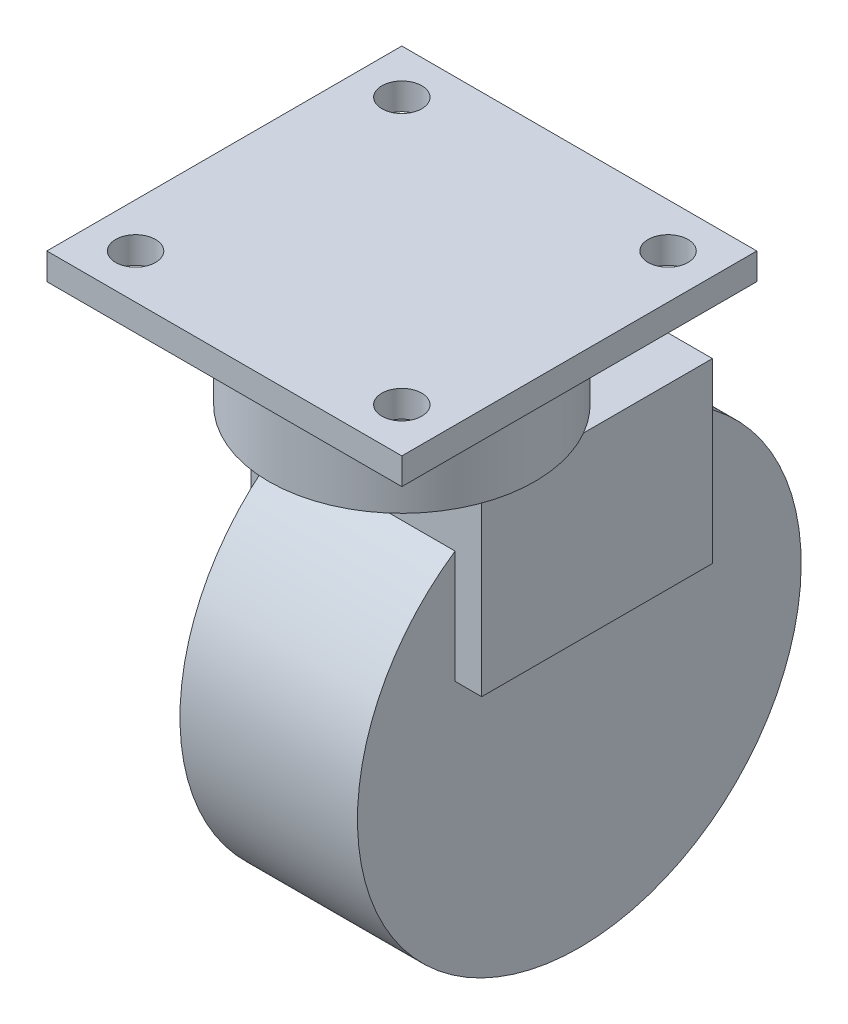
ISO-10303-21;
HEADER;
FILE_DESCRIPTION(('STEP AP214'),'2;1');
FILE_NAME('part.step','',(''),(''),'','','');
FILE_SCHEMA(('AUTOMOTIVE_DESIGN { 1 0 10303 214 1 1 1 1 }'));
ENDSEC;
DATA;
#1=APPLICATION_CONTEXT('core data for automotive mechanical design processes');
#2=APPLICATION_PROTOCOL_DEFINITION('international standard','automotive_design',2000,#1);
#3=PRODUCT_CONTEXT('',#1,'mechanical');
#4=PRODUCT('Part','Part','',(#3));
#5=PRODUCT_RELATED_PRODUCT_CATEGORY('part','',(#4));
#6=PRODUCT_DEFINITION_FORMATION('','',#4);
#7=PRODUCT_DEFINITION_CONTEXT('part definition',#1,'design');
#8=PRODUCT_DEFINITION('design','',#6,#7);
#9=PRODUCT_DEFINITION_SHAPE('','',#8);
#10=(LENGTH_UNIT() NAMED_UNIT(*) SI_UNIT(.MILLI.,.METRE.));
#11=(NAMED_UNIT(*) PLANE_ANGLE_UNIT() SI_UNIT($,.RADIAN.));
#12=(NAMED_UNIT(*) SI_UNIT($,.STERADIAN.) SOLID_ANGLE_UNIT());
#13=UNCERTAINTY_MEASURE_WITH_UNIT(LENGTH_MEASURE(1.E-05),#10,'distance_accuracy_value','');
#14=(GEOMETRIC_REPRESENTATION_CONTEXT(3) GLOBAL_UNCERTAINTY_ASSIGNED_CONTEXT((#13)) GLOBAL_UNIT_ASSIGNED_CONTEXT((#10,
#11,#12)) REPRESENTATION_CONTEXT('',''));
#15=CARTESIAN_POINT('',(0.,0.,0.));
#16=DIRECTION('',(0.,0.,1.));
#17=DIRECTION('',(1.,0.,0.));
#18=AXIS2_PLACEMENT_3D('',#15,#16,#17);
#19=CARTESIAN_POINT('',(0.,-35.,0.));
#20=DIRECTION('',(0.,1.,0.));
#21=DIRECTION('',(0.,0.,1.));
#22=AXIS2_PLACEMENT_3D('',#19,#20,#21);
#23=PLANE('',#22);
#24=DIRECTION('',(0.,0.,-1.));
#25=VECTOR('',#24,1.);
#26=CARTESIAN_POINT('',(-10.,-35.,0.));
#27=LINE('',#26,#25);
#28=CARTESIAN_POINT('',(-10.,-35.,4.));
#29=VERTEX_POINT('',#28);
#30=CARTESIAN_POINT('',(-10.,-35.,-22.));
#31=VERTEX_POINT('',#30);
#32=EDGE_CURVE('E132',#29,#31,#27,.T.);
#33=ORIENTED_EDGE('',*,*,#32,.F.);
#34=DIRECTION('',(1.,0.,0.));
#35=VECTOR('',#34,1.);
#36=CARTESIAN_POINT('',(-13.,-35.,4.));
#37=LINE('',#36,#35);
#38=CARTESIAN_POINT('',(-13.,-35.,4.));
#39=VERTEX_POINT('',#38);
#40=EDGE_CURVE('E242',#39,#29,#37,.T.);
#41=ORIENTED_EDGE('',*,*,#40,.F.);
#42=DIRECTION('',(0.,0.,1.));
#43=VECTOR('',#42,1.);
#44=CARTESIAN_POINT('',(-13.,-35.,-22.));
#45=LINE('',#44,#43);
#46=CARTESIAN_POINT('',(-13.,-35.,-22.));
#47=VERTEX_POINT('',#46);
#48=EDGE_CURVE('E140',#47,#39,#45,.T.);
#49=ORIENTED_EDGE('',*,*,#48,.F.);
#50=DIRECTION('',(-1.,0.,0.));
#51=VECTOR('',#50,1.);
#52=CARTESIAN_POINT('',(-13.,-35.,-22.));
#53=LINE('',#52,#51);
#54=EDGE_CURVE('E135',#31,#47,#53,.T.);
#55=ORIENTED_EDGE('',*,*,#54,.F.);
#56=EDGE_LOOP('',(#33,#41,#49,#55));
#57=FACE_BOUND('',#56,.T.);
#58=ADVANCED_FACE('F39',(#57),#23,.F.);
#59=CARTESIAN_POINT('',(-20.,-3.,-20.));
#60=DIRECTION('',(-1.,0.,0.));
#61=DIRECTION('',(0.,0.,1.));
#62=AXIS2_PLACEMENT_3D('',#59,#60,#61);
#63=PLANE('',#62);
#64=DIRECTION('',(0.,0.,1.));
#65=VECTOR('',#64,1.);
#66=CARTESIAN_POINT('',(-20.,0.,-20.));
#67=LINE('',#66,#65);
#68=CARTESIAN_POINT('',(-20.,0.,-20.));
#69=VERTEX_POINT('',#68);
#70=CARTESIAN_POINT('',(-20.,0.,20.));
#71=VERTEX_POINT('',#70);
#72=EDGE_CURVE('E178',#69,#71,#67,.T.);
#73=ORIENTED_EDGE('',*,*,#72,.F.);
#74=DIRECTION('',(0.,1.,0.));
#75=VECTOR('',#74,1.);
#76=CARTESIAN_POINT('',(-20.,-3.,-20.));
#77=LINE('',#76,#75);
#78=CARTESIAN_POINT('',(-20.,-3.,-20.));
#79=VERTEX_POINT('',#78);
#80=EDGE_CURVE('E157',#79,#69,#77,.T.);
#81=ORIENTED_EDGE('',*,*,#80,.F.);
#82=DIRECTION('',(0.,0.,1.));
#83=VECTOR('',#82,1.);
#84=CARTESIAN_POINT('',(-20.,-3.,-20.));
#85=LINE('',#84,#83);
#86=CARTESIAN_POINT('',(-20.,-3.,20.));
#87=VERTEX_POINT('',#86);
#88=EDGE_CURVE('E171',#79,#87,#85,.T.);
#89=ORIENTED_EDGE('',*,*,#88,.T.);
#90=DIRECTION('',(0.,1.,0.));
#91=VECTOR('',#90,1.);
#92=CARTESIAN_POINT('',(-20.,-3.,20.));
#93=LINE('',#92,#91);
#94=EDGE_CURVE('E158',#87,#71,#93,.T.);
#95=ORIENTED_EDGE('',*,*,#94,.T.);
#96=EDGE_LOOP('',(#73,#81,#89,#95));
#97=FACE_BOUND('',#96,.T.);
#98=ADVANCED_FACE('F41',(#97),#63,.T.);
#99=CARTESIAN_POINT('',(-20.,-3.,-20.));
#100=DIRECTION('',(0.,0.,-1.));
#101=DIRECTION('',(-1.,0.,0.));
#102=AXIS2_PLACEMENT_3D('',#99,#100,#101);
#103=PLANE('',#102);
#104=DIRECTION('',(-1.,0.,0.));
#105=VECTOR('',#104,1.);
#106=CARTESIAN_POINT('',(-20.,0.,-20.));
#107=LINE('',#106,#105);
#108=CARTESIAN_POINT('',(20.,0.,-20.));
#109=VERTEX_POINT('',#108);
#110=EDGE_CURVE('E166',#109,#69,#107,.T.);
#111=ORIENTED_EDGE('',*,*,#110,.F.);
#112=DIRECTION('',(0.,1.,0.));
#113=VECTOR('',#112,1.);
#114=CARTESIAN_POINT('',(20.,-3.,-20.));
#115=LINE('',#114,#113);
#116=CARTESIAN_POINT('',(20.,-3.,-20.));
#117=VERTEX_POINT('',#116);
#118=EDGE_CURVE('E164',#117,#109,#115,.T.);
#119=ORIENTED_EDGE('',*,*,#118,.F.);
#120=DIRECTION('',(-1.,0.,0.));
#121=VECTOR('',#120,1.);
#122=CARTESIAN_POINT('',(-20.,-3.,-20.));
#123=LINE('',#122,#121);
#124=EDGE_CURVE('E161',#117,#79,#123,.T.);
#125=ORIENTED_EDGE('',*,*,#124,.T.);
#126=ORIENTED_EDGE('',*,*,#80,.T.);
#127=EDGE_LOOP('',(#111,#119,#125,#126));
#128=FACE_BOUND('',#127,.T.);
#129=ADVANCED_FACE('F317',(#128),#103,.T.);
#130=CARTESIAN_POINT('',(20.,-3.,-20.));
#131=DIRECTION('',(1.,0.,0.));
#132=DIRECTION('',(0.,0.,-1.));
#133=AXIS2_PLACEMENT_3D('',#130,#131,#132);
#134=PLANE('',#133);
#135=DIRECTION('',(0.,0.,-1.));
#136=VECTOR('',#135,1.);
#137=CARTESIAN_POINT('',(20.,0.,-20.));
#138=LINE('',#137,#136);
#139=CARTESIAN_POINT('',(20.,0.,20.));
#140=VERTEX_POINT('',#139);
#141=EDGE_CURVE('E175',#140,#109,#138,.T.);
#142=ORIENTED_EDGE('',*,*,#141,.F.);
#143=DIRECTION('',(0.,1.,0.));
#144=VECTOR('',#143,1.);
#145=CARTESIAN_POINT('',(20.,-3.,20.));
#146=LINE('',#145,#144);
#147=CARTESIAN_POINT('',(20.,-3.,20.));
#148=VERTEX_POINT('',#147);
#149=EDGE_CURVE('E162',#148,#140,#146,.T.);
#150=ORIENTED_EDGE('',*,*,#149,.F.);
#151=DIRECTION('',(0.,0.,-1.));
#152=VECTOR('',#151,1.);
#153=CARTESIAN_POINT('',(20.,-3.,-20.));
#154=LINE('',#153,#152);
#155=EDGE_CURVE('E183',#148,#117,#154,.T.);
#156=ORIENTED_EDGE('',*,*,#155,.T.);
#157=ORIENTED_EDGE('',*,*,#118,.T.);
#158=EDGE_LOOP('',(#142,#150,#156,#157));
#159=FACE_BOUND('',#158,.T.);
#160=ADVANCED_FACE('F318',(#159),#134,.T.);
#161=CARTESIAN_POINT('',(-20.,-3.,20.));
#162=DIRECTION('',(0.,0.,1.));
#163=DIRECTION('',(1.,0.,0.));
#164=AXIS2_PLACEMENT_3D('',#161,#162,#163);
#165=PLANE('',#164);
#166=DIRECTION('',(1.,0.,0.));
#167=VECTOR('',#166,1.);
#168=CARTESIAN_POINT('',(-20.,0.,20.));
#169=LINE('',#168,#167);
#170=EDGE_CURVE('E174',#71,#140,#169,.T.);
#171=ORIENTED_EDGE('',*,*,#170,.F.);
#172=ORIENTED_EDGE('',*,*,#94,.F.);
#173=DIRECTION('',(1.,0.,0.));
#174=VECTOR('',#173,1.);
#175=CARTESIAN_POINT('',(-20.,-3.,20.));
#176=LINE('',#175,#174);
#177=EDGE_CURVE('E190',#87,#148,#176,.T.);
#178=ORIENTED_EDGE('',*,*,#177,.T.);
#179=ORIENTED_EDGE('',*,*,#149,.T.);
#180=EDGE_LOOP('',(#171,#172,#178,#179));
#181=FACE_BOUND('',#180,.T.);
#182=ADVANCED_FACE('F299',(#181),#165,.T.);
#183=CARTESIAN_POINT('',(0.,-3.,0.));
#184=DIRECTION('',(0.,1.,0.));
#185=DIRECTION('',(0.,0.,1.));
#186=AXIS2_PLACEMENT_3D('',#183,#184,#185);
#187=PLANE('',#186);
#188=CARTESIAN_POINT('',(0.,-3.,0.));
#189=DIRECTION('',(0.,1.,0.));
#190=DIRECTION('',(0.,0.,1.));
#191=AXIS2_PLACEMENT_3D('',#188,#189,#190);
#192=CIRCLE('',#191,15.);
#193=CARTESIAN_POINT('',(0.,-3.,15.));
#194=VERTEX_POINT('',#193);
#195=EDGE_CURVE('E218',#194,#194,#192,.T.);
#196=ORIENTED_EDGE('',*,*,#195,.T.);
#197=EDGE_LOOP('',(#196));
#198=FACE_BOUND('',#197,.T.);
#199=CARTESIAN_POINT('',(-15.,-3.,15.));
#200=DIRECTION('',(0.,1.,0.));
#201=DIRECTION('',(0.,0.,1.));
#202=AXIS2_PLACEMENT_3D('',#199,#200,#201);
#203=CIRCLE('',#202,2.25);
#204=CARTESIAN_POINT('',(-15.,-3.,17.25));
#205=VERTEX_POINT('',#204);
#206=EDGE_CURVE('E203',#205,#205,#203,.T.);
#207=ORIENTED_EDGE('',*,*,#206,.T.);
#208=EDGE_LOOP('',(#207));
#209=FACE_BOUND('',#208,.T.);
#210=CARTESIAN_POINT('',(15.,-3.,-15.));
#211=DIRECTION('',(0.,1.,0.));
#212=DIRECTION('',(0.,0.,1.));
#213=AXIS2_PLACEMENT_3D('',#210,#211,#212);
#214=CIRCLE('',#213,2.25);
#215=CARTESIAN_POINT('',(15.,-3.,-12.75));
#216=VERTEX_POINT('',#215);
#217=EDGE_CURVE('E196',#216,#216,#214,.T.);
#218=ORIENTED_EDGE('',*,*,#217,.T.);
#219=EDGE_LOOP('',(#218));
#220=FACE_BOUND('',#219,.T.);
#221=CARTESIAN_POINT('',(-15.,-3.,-15.));
#222=DIRECTION('',(0.,1.,0.));
#223=DIRECTION('',(0.,0.,1.));
#224=AXIS2_PLACEMENT_3D('',#221,#222,#223);
#225=CIRCLE('',#224,2.25);
#226=CARTESIAN_POINT('',(-15.,-3.,-12.75));
#227=VERTEX_POINT('',#226);
#228=EDGE_CURVE('E208',#227,#227,#225,.T.);
#229=ORIENTED_EDGE('',*,*,#228,.T.);
#230=EDGE_LOOP('',(#229));
#231=FACE_BOUND('',#230,.T.);
#232=CARTESIAN_POINT('',(15.,-3.,15.));
#233=DIRECTION('',(0.,1.,0.));
#234=DIRECTION('',(0.,0.,1.));
#235=AXIS2_PLACEMENT_3D('',#232,#233,#234);
#236=CIRCLE('',#235,2.25);
#237=CARTESIAN_POINT('',(15.,-3.,17.25));
#238=VERTEX_POINT('',#237);
#239=EDGE_CURVE('E181',#238,#238,#236,.T.);
#240=ORIENTED_EDGE('',*,*,#239,.T.);
#241=EDGE_LOOP('',(#240));
#242=FACE_BOUND('',#241,.T.);
#243=ORIENTED_EDGE('',*,*,#88,.F.);
#244=ORIENTED_EDGE('',*,*,#124,.F.);
#245=ORIENTED_EDGE('',*,*,#155,.F.);
#246=ORIENTED_EDGE('',*,*,#177,.F.);
#247=EDGE_LOOP('',(#243,#244,#245,#246));
#248=FACE_BOUND('',#247,.T.);
#249=ADVANCED_FACE('F294',(#198,#209,#220,#231,#242,#248),#187,.F.);
#250=CARTESIAN_POINT('',(0.,0.,0.));
#251=DIRECTION('',(0.,1.,0.));
#252=DIRECTION('',(0.,0.,1.));
#253=AXIS2_PLACEMENT_3D('',#250,#251,#252);
#254=PLANE('',#253);
#255=CARTESIAN_POINT('',(-15.,0.,15.));
#256=DIRECTION('',(0.,1.,0.));
#257=DIRECTION('',(0.,0.,1.));
#258=AXIS2_PLACEMENT_3D('',#255,#256,#257);
#259=CIRCLE('',#258,2.25);
#260=CARTESIAN_POINT('',(-15.,0.,17.25));
#261=VERTEX_POINT('',#260);
#262=EDGE_CURVE('E193',#261,#261,#259,.T.);
#263=ORIENTED_EDGE('',*,*,#262,.F.);
#264=EDGE_LOOP('',(#263));
#265=FACE_BOUND('',#264,.T.);
#266=CARTESIAN_POINT('',(15.,0.,-15.));
#267=DIRECTION('',(0.,1.,0.));
#268=DIRECTION('',(0.,0.,1.));
#269=AXIS2_PLACEMENT_3D('',#266,#267,#268);
#270=CIRCLE('',#269,2.25);
#271=CARTESIAN_POINT('',(15.,0.,-12.75));
#272=VERTEX_POINT('',#271);
#273=EDGE_CURVE('E202',#272,#272,#270,.T.);
#274=ORIENTED_EDGE('',*,*,#273,.F.);
#275=EDGE_LOOP('',(#274));
#276=FACE_BOUND('',#275,.T.);
#277=CARTESIAN_POINT('',(-15.,0.,-15.));
#278=DIRECTION('',(0.,1.,0.));
#279=DIRECTION('',(0.,0.,1.));
#280=AXIS2_PLACEMENT_3D('',#277,#278,#279);
#281=CIRCLE('',#280,2.25);
#282=CARTESIAN_POINT('',(-15.,0.,-12.75));
#283=VERTEX_POINT('',#282);
#284=EDGE_CURVE('E204',#283,#283,#281,.T.);
#285=ORIENTED_EDGE('',*,*,#284,.F.);
#286=EDGE_LOOP('',(#285));
#287=FACE_BOUND('',#286,.T.);
#288=CARTESIAN_POINT('',(15.,0.,15.));
#289=DIRECTION('',(0.,1.,0.));
#290=DIRECTION('',(0.,0.,1.));
#291=AXIS2_PLACEMENT_3D('',#288,#289,#290);
#292=CIRCLE('',#291,2.25);
#293=CARTESIAN_POINT('',(15.,0.,17.25));
#294=VERTEX_POINT('',#293);
#295=EDGE_CURVE('E195',#294,#294,#292,.T.);
#296=ORIENTED_EDGE('',*,*,#295,.F.);
#297=EDGE_LOOP('',(#296));
#298=FACE_BOUND('',#297,.T.);
#299=ORIENTED_EDGE('',*,*,#72,.T.);
#300=ORIENTED_EDGE('',*,*,#170,.T.);
#301=ORIENTED_EDGE('',*,*,#141,.T.);
#302=ORIENTED_EDGE('',*,*,#110,.T.);
#303=EDGE_LOOP('',(#299,#300,#301,#302));
#304=FACE_BOUND('',#303,.T.);
#305=ADVANCED_FACE('F296',(#265,#276,#287,#298,#304),#254,.T.);
#306=CARTESIAN_POINT('',(15.,-3.,15.));
#307=DIRECTION('',(0.,1.,0.));
#308=DIRECTION('',(0.,0.,1.));
#309=AXIS2_PLACEMENT_3D('',#306,#307,#308);
#310=CYLINDRICAL_SURFACE('',#309,2.25);
#311=ORIENTED_EDGE('',*,*,#239,.F.);
#312=EDGE_LOOP('',(#311));
#313=FACE_BOUND('',#312,.T.);
#314=ORIENTED_EDGE('',*,*,#295,.T.);
#315=EDGE_LOOP('',(#314));
#316=FACE_BOUND('',#315,.T.);
#317=ADVANCED_FACE('F323',(#313,#316),#310,.F.);
#318=CARTESIAN_POINT('',(-15.,-3.,-15.));
#319=DIRECTION('',(0.,1.,0.));
#320=DIRECTION('',(0.,0.,1.));
#321=AXIS2_PLACEMENT_3D('',#318,#319,#320);
#322=CYLINDRICAL_SURFACE('',#321,2.25);
#323=ORIENTED_EDGE('',*,*,#228,.F.);
#324=EDGE_LOOP('',(#323));
#325=FACE_BOUND('',#324,.T.);
#326=ORIENTED_EDGE('',*,*,#284,.T.);
#327=EDGE_LOOP('',(#326));
#328=FACE_BOUND('',#327,.T.);
#329=ADVANCED_FACE('F334',(#325,#328),#322,.F.);
#330=CARTESIAN_POINT('',(15.,-3.,-15.));
#331=DIRECTION('',(0.,1.,0.));
#332=DIRECTION('',(0.,0.,1.));
#333=AXIS2_PLACEMENT_3D('',#330,#331,#332);
#334=CYLINDRICAL_SURFACE('',#333,2.25);
#335=ORIENTED_EDGE('',*,*,#217,.F.);
#336=EDGE_LOOP('',(#335));
#337=FACE_BOUND('',#336,.T.);
#338=ORIENTED_EDGE('',*,*,#273,.T.);
#339=EDGE_LOOP('',(#338));
#340=FACE_BOUND('',#339,.T.);
#341=ADVANCED_FACE('F364',(#337,#340),#334,.F.);
#342=CARTESIAN_POINT('',(-15.,-3.,15.));
#343=DIRECTION('',(0.,1.,0.));
#344=DIRECTION('',(0.,0.,1.));
#345=AXIS2_PLACEMENT_3D('',#342,#343,#344);
#346=CYLINDRICAL_SURFACE('',#345,2.25);
#347=ORIENTED_EDGE('',*,*,#206,.F.);
#348=EDGE_LOOP('',(#347));
#349=FACE_BOUND('',#348,.T.);
#350=ORIENTED_EDGE('',*,*,#262,.T.);
#351=EDGE_LOOP('',(#350));
#352=FACE_BOUND('',#351,.T.);
#353=ADVANCED_FACE('F293',(#349,#352),#346,.F.);
#354=CARTESIAN_POINT('',(0.,-15.,0.));
#355=DIRECTION('',(0.,1.,0.));
#356=DIRECTION('',(0.,0.,1.));
#357=AXIS2_PLACEMENT_3D('',#354,#355,#356);
#358=CYLINDRICAL_SURFACE('',#357,15.);
#359=CARTESIAN_POINT('',(0.,-15.,0.));
#360=DIRECTION('',(0.,1.,0.));
#361=DIRECTION('',(0.,0.,1.));
#362=AXIS2_PLACEMENT_3D('',#359,#360,#361);
#363=CIRCLE('',#362,15.);
#364=CARTESIAN_POINT('',(13.,-15.,-7.48331477354788));
#365=VERTEX_POINT('',#364);
#366=CARTESIAN_POINT('',(-13.,-15.,-7.48331477354789));
#367=VERTEX_POINT('',#366);
#368=EDGE_CURVE('E214',#365,#367,#363,.T.);
#369=ORIENTED_EDGE('',*,*,#368,.T.);
#370=EDGE_CURVE('E219',#367,#365,#363,.T.);
#371=ORIENTED_EDGE('',*,*,#370,.T.);
#372=EDGE_LOOP('',(#369,#371));
#373=FACE_BOUND('',#372,.T.);
#374=ORIENTED_EDGE('',*,*,#195,.F.);
#375=EDGE_LOOP('',(#374));
#376=FACE_BOUND('',#375,.T.);
#377=ADVANCED_FACE('F290',(#373,#376),#358,.T.);
#378=CARTESIAN_POINT('',(0.,-15.,0.));
#379=DIRECTION('',(0.,1.,0.));
#380=DIRECTION('',(0.,0.,1.));
#381=AXIS2_PLACEMENT_3D('',#378,#379,#380);
#382=PLANE('',#381);
#383=ORIENTED_EDGE('',*,*,#370,.F.);
#384=DIRECTION('',(0.,0.,1.));
#385=VECTOR('',#384,1.);
#386=CARTESIAN_POINT('',(-13.,-15.,-22.));
#387=LINE('',#386,#385);
#388=CARTESIAN_POINT('',(-13.,-15.,4.));
#389=VERTEX_POINT('',#388);
#390=EDGE_CURVE('E151',#367,#389,#387,.T.);
#391=ORIENTED_EDGE('',*,*,#390,.T.);
#392=DIRECTION('',(1.,0.,0.));
#393=VECTOR('',#392,1.);
#394=CARTESIAN_POINT('',(-13.,-15.,4.));
#395=LINE('',#394,#393);
#396=CARTESIAN_POINT('',(13.,-15.,4.));
#397=VERTEX_POINT('',#396);
#398=EDGE_CURVE('E238',#389,#397,#395,.T.);
#399=ORIENTED_EDGE('',*,*,#398,.T.);
#400=DIRECTION('',(0.,0.,-1.));
#401=VECTOR('',#400,1.);
#402=CARTESIAN_POINT('',(13.,-15.,-22.));
#403=LINE('',#402,#401);
#404=EDGE_CURVE('E234',#397,#365,#403,.T.);
#405=ORIENTED_EDGE('',*,*,#404,.T.);
#406=EDGE_LOOP('',(#383,#391,#399,#405));
#407=FACE_BOUND('',#406,.T.);
#408=ADVANCED_FACE('F287',(#407),#382,.F.);
#409=CARTESIAN_POINT('',(0.,-15.,0.));
#410=DIRECTION('',(0.,1.,0.));
#411=DIRECTION('',(0.,0.,1.));
#412=AXIS2_PLACEMENT_3D('',#409,#410,#411);
#413=PLANE('',#412);
#414=ORIENTED_EDGE('',*,*,#368,.F.);
#415=CARTESIAN_POINT('',(13.,-15.,-22.));
#416=VERTEX_POINT('',#415);
#417=EDGE_CURVE('E240',#365,#416,#403,.T.);
#418=ORIENTED_EDGE('',*,*,#417,.T.);
#419=DIRECTION('',(-1.,0.,0.));
#420=VECTOR('',#419,1.);
#421=CARTESIAN_POINT('',(-13.,-15.,-22.));
#422=LINE('',#421,#420);
#423=CARTESIAN_POINT('',(-13.,-15.,-22.));
#424=VERTEX_POINT('',#423);
#425=EDGE_CURVE('E233',#416,#424,#422,.T.);
#426=ORIENTED_EDGE('',*,*,#425,.T.);
#427=EDGE_CURVE('E160',#424,#367,#387,.T.);
#428=ORIENTED_EDGE('',*,*,#427,.T.);
#429=EDGE_LOOP('',(#414,#418,#426,#428));
#430=FACE_BOUND('',#429,.T.);
#431=ADVANCED_FACE('F274',(#430),#413,.T.);
#432=CARTESIAN_POINT('',(-13.,-35.,-22.));
#433=DIRECTION('',(-1.,0.,0.));
#434=DIRECTION('',(0.,0.,1.));
#435=AXIS2_PLACEMENT_3D('',#432,#433,#434);
#436=PLANE('',#435);
#437=ORIENTED_EDGE('',*,*,#427,.F.);
#438=DIRECTION('',(0.,1.,0.));
#439=VECTOR('',#438,1.);
#440=CARTESIAN_POINT('',(-13.,-35.,-22.));
#441=LINE('',#440,#439);
#442=EDGE_CURVE('E217',#47,#424,#441,.T.);
#443=ORIENTED_EDGE('',*,*,#442,.F.);
#444=ORIENTED_EDGE('',*,*,#48,.T.);
#445=DIRECTION('',(0.,1.,0.));
#446=VECTOR('',#445,1.);
#447=CARTESIAN_POINT('',(-13.,-35.,4.));
#448=LINE('',#447,#446);
#449=EDGE_CURVE('E225',#39,#389,#448,.T.);
#450=ORIENTED_EDGE('',*,*,#449,.T.);
#451=ORIENTED_EDGE('',*,*,#390,.F.);
#452=EDGE_LOOP('',(#437,#443,#444,#450,#451));
#453=FACE_BOUND('',#452,.T.);
#454=ADVANCED_FACE('F268',(#453),#436,.T.);
#455=CARTESIAN_POINT('',(-13.,-35.,-22.));
#456=DIRECTION('',(0.,0.,-1.));
#457=DIRECTION('',(-1.,0.,0.));
#458=AXIS2_PLACEMENT_3D('',#455,#456,#457);
#459=PLANE('',#458);
#460=DIRECTION('',(0.,-1.,0.));
#461=VECTOR('',#460,1.);
#462=CARTESIAN_POINT('',(10.,-35.,-22.));
#463=LINE('',#462,#461);
#464=CARTESIAN_POINT('',(10.,-21.0682878005387,-22.));
#465=VERTEX_POINT('',#464);
#466=CARTESIAN_POINT('',(10.,-35.,-22.));
#467=VERTEX_POINT('',#466);
#468=EDGE_CURVE('E53',#465,#467,#463,.T.);
#469=ORIENTED_EDGE('',*,*,#468,.F.);
#470=DIRECTION('',(-1.,0.,0.));
#471=VECTOR('',#470,1.);
#472=CARTESIAN_POINT('',(10.,-21.0682878005387,-22.));
#473=LINE('',#472,#471);
#474=CARTESIAN_POINT('',(-10.,-21.0682878005387,-22.));
#475=VERTEX_POINT('',#474);
#476=EDGE_CURVE('E59',#465,#475,#473,.T.);
#477=ORIENTED_EDGE('',*,*,#476,.T.);
#478=DIRECTION('',(0.,-1.,0.));
#479=VECTOR('',#478,1.);
#480=CARTESIAN_POINT('',(-10.,-35.,-22.));
#481=LINE('',#480,#479);
#482=EDGE_CURVE('E141',#475,#31,#481,.T.);
#483=ORIENTED_EDGE('',*,*,#482,.T.);
#484=ORIENTED_EDGE('',*,*,#54,.T.);
#485=ORIENTED_EDGE('',*,*,#442,.T.);
#486=ORIENTED_EDGE('',*,*,#425,.F.);
#487=DIRECTION('',(0.,1.,0.));
#488=VECTOR('',#487,1.);
#489=CARTESIAN_POINT('',(13.,-35.,-22.));
#490=LINE('',#489,#488);
#491=CARTESIAN_POINT('',(13.,-35.,-22.));
#492=VERTEX_POINT('',#491);
#493=EDGE_CURVE('E227',#492,#416,#490,.T.);
#494=ORIENTED_EDGE('',*,*,#493,.F.);
#495=EDGE_CURVE('E138',#492,#467,#53,.T.);
#496=ORIENTED_EDGE('',*,*,#495,.T.);
#497=EDGE_LOOP('',(#469,#477,#483,#484,#485,#486,#494,#496));
#498=FACE_BOUND('',#497,.T.);
#499=ADVANCED_FACE('F144',(#498),#459,.T.);
#500=CARTESIAN_POINT('',(13.,-35.,-22.));
#501=DIRECTION('',(1.,0.,0.));
#502=DIRECTION('',(0.,0.,-1.));
#503=AXIS2_PLACEMENT_3D('',#500,#501,#502);
#504=PLANE('',#503);
#505=ORIENTED_EDGE('',*,*,#404,.F.);
#506=DIRECTION('',(0.,1.,0.));
#507=VECTOR('',#506,1.);
#508=CARTESIAN_POINT('',(13.,-35.,4.));
#509=LINE('',#508,#507);
#510=CARTESIAN_POINT('',(13.,-35.,4.));
#511=VERTEX_POINT('',#510);
#512=EDGE_CURVE('E223',#511,#397,#509,.T.);
#513=ORIENTED_EDGE('',*,*,#512,.F.);
#514=DIRECTION('',(0.,0.,-1.));
#515=VECTOR('',#514,1.);
#516=CARTESIAN_POINT('',(13.,-35.,-22.));
#517=LINE('',#516,#515);
#518=EDGE_CURVE('E142',#511,#492,#517,.T.);
#519=ORIENTED_EDGE('',*,*,#518,.T.);
#520=ORIENTED_EDGE('',*,*,#493,.T.);
#521=ORIENTED_EDGE('',*,*,#417,.F.);
#522=EDGE_LOOP('',(#505,#513,#519,#520,#521));
#523=FACE_BOUND('',#522,.T.);
#524=ADVANCED_FACE('F279',(#523),#504,.T.);
#525=CARTESIAN_POINT('',(-13.,-35.,4.));
#526=DIRECTION('',(0.,0.,1.));
#527=DIRECTION('',(1.,0.,0.));
#528=AXIS2_PLACEMENT_3D('',#525,#526,#527);
#529=PLANE('',#528);
#530=DIRECTION('',(0.,1.,0.));
#531=VECTOR('',#530,1.);
#532=CARTESIAN_POINT('',(10.,-35.,4.));
#533=LINE('',#532,#531);
#534=CARTESIAN_POINT('',(10.,-35.,4.));
#535=VERTEX_POINT('',#534);
#536=CARTESIAN_POINT('',(10.,-22.287684822792,4.));
#537=VERTEX_POINT('',#536);
#538=EDGE_CURVE('E149',#535,#537,#533,.T.);
#539=ORIENTED_EDGE('',*,*,#538,.F.);
#540=EDGE_CURVE('E246',#535,#511,#37,.T.);
#541=ORIENTED_EDGE('',*,*,#540,.T.);
#542=ORIENTED_EDGE('',*,*,#512,.T.);
#543=ORIENTED_EDGE('',*,*,#398,.F.);
#544=ORIENTED_EDGE('',*,*,#449,.F.);
#545=ORIENTED_EDGE('',*,*,#40,.T.);
#546=DIRECTION('',(0.,1.,0.));
#547=VECTOR('',#546,1.);
#548=CARTESIAN_POINT('',(-10.,-35.,4.));
#549=LINE('',#548,#547);
#550=CARTESIAN_POINT('',(-10.,-22.287684822792,4.));
#551=VERTEX_POINT('',#550);
#552=EDGE_CURVE('E146',#29,#551,#549,.T.);
#553=ORIENTED_EDGE('',*,*,#552,.T.);
#554=DIRECTION('',(-1.,0.,0.));
#555=VECTOR('',#554,1.);
#556=CARTESIAN_POINT('',(10.,-22.287684822792,4.));
#557=LINE('',#556,#555);
#558=EDGE_CURVE('E11',#551,#537,#557,.F.);
#559=ORIENTED_EDGE('',*,*,#558,.T.);
#560=EDGE_LOOP('',(#539,#541,#542,#543,#544,#545,#553,#559));
#561=FACE_BOUND('',#560,.T.);
#562=ADVANCED_FACE('F262',(#561),#529,.T.);
#563=ORIENTED_EDGE('',*,*,#540,.F.);
#564=DIRECTION('',(0.,0.,-1.));
#565=VECTOR('',#564,1.);
#566=CARTESIAN_POINT('',(10.,-35.,0.));
#567=LINE('',#566,#565);
#568=EDGE_CURVE('E50',#535,#467,#567,.T.);
#569=ORIENTED_EDGE('',*,*,#568,.T.);
#570=ORIENTED_EDGE('',*,*,#495,.F.);
#571=ORIENTED_EDGE('',*,*,#518,.F.);
#572=EDGE_LOOP('',(#563,#569,#570,#571));
#573=FACE_BOUND('',#572,.T.);
#574=ADVANCED_FACE('F281',(#573),#23,.F.);
#575=CARTESIAN_POINT('',(10.,-43.,-10.));
#576=DIRECTION('',(-1.,0.,0.));
#577=DIRECTION('',(0.,0.,1.));
#578=AXIS2_PLACEMENT_3D('',#575,#576,#577);
#579=CYLINDRICAL_SURFACE('',#578,25.);
#580=ORIENTED_EDGE('',*,*,#476,.F.);
#581=CARTESIAN_POINT('',(10.,-43.,-10.));
#582=DIRECTION('',(1.,0.,0.));
#583=DIRECTION('',(0.,0.,-1.));
#584=AXIS2_PLACEMENT_3D('',#581,#582,#583);
#585=CIRCLE('',#584,25.);
#586=EDGE_CURVE('E254',#537,#465,#585,.T.);
#587=ORIENTED_EDGE('',*,*,#586,.F.);
#588=ORIENTED_EDGE('',*,*,#558,.F.);
#589=CARTESIAN_POINT('',(-10.,-43.,-10.));
#590=DIRECTION('',(1.,0.,0.));
#591=DIRECTION('',(0.,0.,-1.));
#592=AXIS2_PLACEMENT_3D('',#589,#590,#591);
#593=CIRCLE('',#592,25.);
#594=EDGE_CURVE('E251',#551,#475,#593,.T.);
#595=ORIENTED_EDGE('',*,*,#594,.T.);
#596=EDGE_LOOP('',(#580,#587,#588,#595));
#597=FACE_BOUND('',#596,.T.);
#598=ADVANCED_FACE('F261',(#597),#579,.T.);
#599=CARTESIAN_POINT('',(10.,-43.,-10.));
#600=DIRECTION('',(1.,0.,0.));
#601=DIRECTION('',(0.,0.,-1.));
#602=AXIS2_PLACEMENT_3D('',#599,#600,#601);
#603=PLANE('',#602);
#604=ORIENTED_EDGE('',*,*,#586,.T.);
#605=ORIENTED_EDGE('',*,*,#468,.T.);
#606=ORIENTED_EDGE('',*,*,#568,.F.);
#607=ORIENTED_EDGE('',*,*,#538,.T.);
#608=EDGE_LOOP('',(#604,#605,#606,#607));
#609=FACE_BOUND('',#608,.T.);
#610=ADVANCED_FACE('F256',(#609),#603,.T.);
#611=CARTESIAN_POINT('',(-10.,-43.,-10.));
#612=DIRECTION('',(1.,0.,0.));
#613=DIRECTION('',(0.,0.,-1.));
#614=AXIS2_PLACEMENT_3D('',#611,#612,#613);
#615=PLANE('',#614);
#616=ORIENTED_EDGE('',*,*,#482,.F.);
#617=ORIENTED_EDGE('',*,*,#594,.F.);
#618=ORIENTED_EDGE('',*,*,#552,.F.);
#619=ORIENTED_EDGE('',*,*,#32,.T.);
#620=EDGE_LOOP('',(#616,#617,#618,#619));
#621=FACE_BOUND('',#620,.T.);
#622=ADVANCED_FACE('F155',(#621),#615,.F.);
#623=CLOSED_SHELL('',(#58,#98,#129,#160,#182,#249,#305,#317,#329,#341,#353,#377,#408,#431,#454,
#499,#524,#562,#574,#598,#610,#622));
#624=MANIFOLD_SOLID_BREP('B2',#623);
#625=ADVANCED_BREP_SHAPE_REPRESENTATION('',(#18,#624),#14);
#626=SHAPE_DEFINITION_REPRESENTATION(#9,#625);
ENDSEC;
END-ISO-10303-21;
